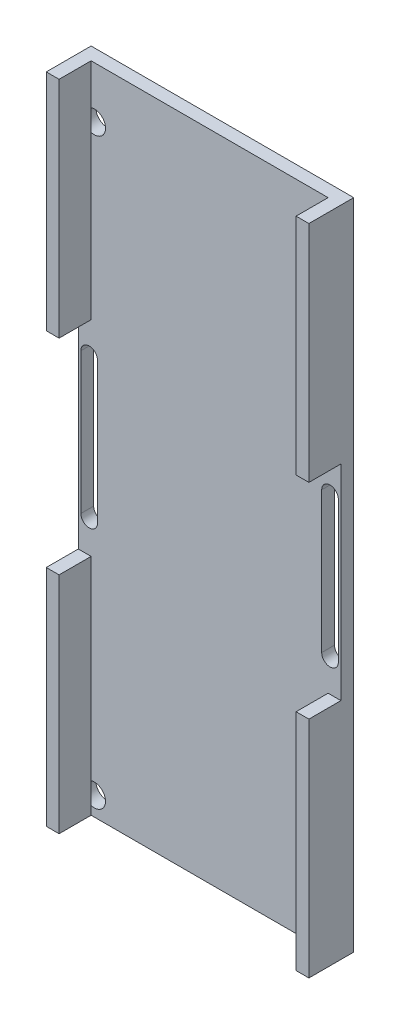
ISO-10303-21;
HEADER;
FILE_DESCRIPTION(('STEP AP214'),'2;1');
FILE_NAME('part.step','',(''),(''),'','','');
FILE_SCHEMA(('AUTOMOTIVE_DESIGN { 1 0 10303 214 1 1 1 1 }'));
ENDSEC;
DATA;
#1=APPLICATION_CONTEXT('core data for automotive mechanical design processes');
#2=APPLICATION_PROTOCOL_DEFINITION('international standard','automotive_design',2000,#1);
#3=PRODUCT_CONTEXT('',#1,'mechanical');
#4=PRODUCT('Part','Part','',(#3));
#5=PRODUCT_RELATED_PRODUCT_CATEGORY('part','',(#4));
#6=PRODUCT_DEFINITION_FORMATION('','',#4);
#7=PRODUCT_DEFINITION_CONTEXT('part definition',#1,'design');
#8=PRODUCT_DEFINITION('design','',#6,#7);
#9=PRODUCT_DEFINITION_SHAPE('','',#8);
#10=(LENGTH_UNIT() NAMED_UNIT(*) SI_UNIT(.MILLI.,.METRE.));
#11=(NAMED_UNIT(*) PLANE_ANGLE_UNIT() SI_UNIT($,.RADIAN.));
#12=(NAMED_UNIT(*) SI_UNIT($,.STERADIAN.) SOLID_ANGLE_UNIT());
#13=UNCERTAINTY_MEASURE_WITH_UNIT(LENGTH_MEASURE(1.E-05),#10,'distance_accuracy_value','');
#14=(GEOMETRIC_REPRESENTATION_CONTEXT(3) GLOBAL_UNCERTAINTY_ASSIGNED_CONTEXT((#13)) GLOBAL_UNIT_ASSIGNED_CONTEXT((#10,
#11,#12)) REPRESENTATION_CONTEXT('',''));
#15=CARTESIAN_POINT('',(0.,0.,0.));
#16=DIRECTION('',(0.,0.,1.));
#17=DIRECTION('',(1.,0.,0.));
#18=AXIS2_PLACEMENT_3D('',#15,#16,#17);
#19=CARTESIAN_POINT('',(0.,0.,2.));
#20=DIRECTION('',(0.,0.,1.));
#21=DIRECTION('',(1.,0.,0.));
#22=AXIS2_PLACEMENT_3D('',#19,#20,#21);
#23=PLANE('',#22);
#24=DIRECTION('',(0.,-1.,0.));
#25=VECTOR('',#24,1.);
#26=CARTESIAN_POINT('',(18.5,-16.,2.));
#27=LINE('',#26,#25);
#28=CARTESIAN_POINT('',(18.5,-49.6770509831248,2.));
#29=VERTEX_POINT('',#28);
#30=CARTESIAN_POINT('',(18.5,-51.,2.));
#31=VERTEX_POINT('',#30);
#32=EDGE_CURVE('E11',#29,#31,#27,.T.);
#33=ORIENTED_EDGE('',*,*,#32,.F.);
#34=CARTESIAN_POINT('',(18.,-48.,2.));
#35=DIRECTION('',(0.,0.,1.));
#36=DIRECTION('',(1.,0.,0.));
#37=AXIS2_PLACEMENT_3D('',#34,#35,#36);
#38=CIRCLE('',#37,1.75);
#39=CARTESIAN_POINT('',(18.5,-46.3229490168752,2.));
#40=VERTEX_POINT('',#39);
#41=EDGE_CURVE('E407',#40,#29,#38,.T.);
#42=ORIENTED_EDGE('',*,*,#41,.F.);
#43=CARTESIAN_POINT('',(18.5,-16.,2.));
#44=VERTEX_POINT('',#43);
#45=EDGE_CURVE('E50',#44,#40,#27,.T.);
#46=ORIENTED_EDGE('',*,*,#45,.F.);
#47=DIRECTION('',(-1.,0.,0.));
#48=VECTOR('',#47,1.);
#49=CARTESIAN_POINT('',(20.5,-16.,2.));
#50=LINE('',#49,#48);
#51=CARTESIAN_POINT('',(20.5,-16.,2.));
#52=VERTEX_POINT('',#51);
#53=EDGE_CURVE('E228',#52,#44,#50,.T.);
#54=ORIENTED_EDGE('',*,*,#53,.F.);
#55=DIRECTION('',(0.,1.,0.));
#56=VECTOR('',#55,1.);
#57=CARTESIAN_POINT('',(20.5,-51.,2.));
#58=LINE('',#57,#56);
#59=CARTESIAN_POINT('',(20.5,16.,2.));
#60=VERTEX_POINT('',#59);
#61=EDGE_CURVE('E225',#52,#60,#58,.T.);
#62=ORIENTED_EDGE('',*,*,#61,.T.);
#63=DIRECTION('',(1.,0.,0.));
#64=VECTOR('',#63,1.);
#65=CARTESIAN_POINT('',(18.5,16.,2.));
#66=LINE('',#65,#64);
#67=CARTESIAN_POINT('',(18.5,16.,2.));
#68=VERTEX_POINT('',#67);
#69=EDGE_CURVE('E58',#68,#60,#66,.T.);
#70=ORIENTED_EDGE('',*,*,#69,.F.);
#71=DIRECTION('',(0.,-1.,0.));
#72=VECTOR('',#71,1.);
#73=CARTESIAN_POINT('',(18.5,51.,2.));
#74=LINE('',#73,#72);
#75=CARTESIAN_POINT('',(18.5,41.3229490168751,2.));
#76=VERTEX_POINT('',#75);
#77=EDGE_CURVE('E62',#76,#68,#74,.T.);
#78=ORIENTED_EDGE('',*,*,#77,.F.);
#79=CARTESIAN_POINT('',(18.,43.,2.));
#80=DIRECTION('',(0.,0.,1.));
#81=DIRECTION('',(1.,0.,0.));
#82=AXIS2_PLACEMENT_3D('',#79,#80,#81);
#83=CIRCLE('',#82,1.75);
#84=CARTESIAN_POINT('',(18.5,44.6770509831248,2.));
#85=VERTEX_POINT('',#84);
#86=EDGE_CURVE('E401',#85,#76,#83,.T.);
#87=ORIENTED_EDGE('',*,*,#86,.F.);
#88=CARTESIAN_POINT('',(18.5,51.,2.));
#89=VERTEX_POINT('',#88);
#90=EDGE_CURVE('E257',#89,#85,#74,.T.);
#91=ORIENTED_EDGE('',*,*,#90,.F.);
#92=DIRECTION('',(-1.,0.,0.));
#93=VECTOR('',#92,1.);
#94=CARTESIAN_POINT('',(20.5,51.,2.));
#95=LINE('',#94,#93);
#96=CARTESIAN_POINT('',(-18.5,51.,2.));
#97=VERTEX_POINT('',#96);
#98=EDGE_CURVE('E233',#89,#97,#95,.T.);
#99=ORIENTED_EDGE('',*,*,#98,.T.);
#100=DIRECTION('',(0.,1.,0.));
#101=VECTOR('',#100,1.);
#102=CARTESIAN_POINT('',(-18.5,16.,2.));
#103=LINE('',#102,#101);
#104=CARTESIAN_POINT('',(-18.5,44.6770509831248,2.));
#105=VERTEX_POINT('',#104);
#106=EDGE_CURVE('E48',#105,#97,#103,.T.);
#107=ORIENTED_EDGE('',*,*,#106,.F.);
#108=CARTESIAN_POINT('',(-18.,43.,2.));
#109=DIRECTION('',(0.,0.,1.));
#110=DIRECTION('',(1.,0.,0.));
#111=AXIS2_PLACEMENT_3D('',#108,#109,#110);
#112=CIRCLE('',#111,1.75);
#113=CARTESIAN_POINT('',(-18.5,41.3229490168751,2.));
#114=VERTEX_POINT('',#113);
#115=EDGE_CURVE('E418',#114,#105,#112,.T.);
#116=ORIENTED_EDGE('',*,*,#115,.F.);
#117=CARTESIAN_POINT('',(-18.5,16.,2.));
#118=VERTEX_POINT('',#117);
#119=EDGE_CURVE('E298',#118,#114,#103,.T.);
#120=ORIENTED_EDGE('',*,*,#119,.F.);
#121=DIRECTION('',(1.,0.,0.));
#122=VECTOR('',#121,1.);
#123=CARTESIAN_POINT('',(-20.5,16.,2.));
#124=LINE('',#123,#122);
#125=CARTESIAN_POINT('',(-20.5,16.,2.));
#126=VERTEX_POINT('',#125);
#127=EDGE_CURVE('E271',#126,#118,#124,.T.);
#128=ORIENTED_EDGE('',*,*,#127,.F.);
#129=DIRECTION('',(0.,-1.,0.));
#130=VECTOR('',#129,1.);
#131=CARTESIAN_POINT('',(-20.5,51.,2.));
#132=LINE('',#131,#130);
#133=CARTESIAN_POINT('',(-20.5,-16.,2.));
#134=VERTEX_POINT('',#133);
#135=EDGE_CURVE('E428',#126,#134,#132,.T.);
#136=ORIENTED_EDGE('',*,*,#135,.T.);
#137=DIRECTION('',(-1.,0.,0.));
#138=VECTOR('',#137,1.);
#139=CARTESIAN_POINT('',(-18.5,-16.,2.));
#140=LINE('',#139,#138);
#141=CARTESIAN_POINT('',(-18.5,-16.,2.));
#142=VERTEX_POINT('',#141);
#143=EDGE_CURVE('E317',#142,#134,#140,.T.);
#144=ORIENTED_EDGE('',*,*,#143,.F.);
#145=DIRECTION('',(0.,1.,0.));
#146=VECTOR('',#145,1.);
#147=CARTESIAN_POINT('',(-18.5,-51.,2.));
#148=LINE('',#147,#146);
#149=CARTESIAN_POINT('',(-18.5,-46.3229490168752,2.));
#150=VERTEX_POINT('',#149);
#151=EDGE_CURVE('E327',#150,#142,#148,.T.);
#152=ORIENTED_EDGE('',*,*,#151,.F.);
#153=CARTESIAN_POINT('',(-18.,-48.,2.));
#154=DIRECTION('',(0.,0.,1.));
#155=DIRECTION('',(1.,0.,0.));
#156=AXIS2_PLACEMENT_3D('',#153,#154,#155);
#157=CIRCLE('',#156,1.75);
#158=CARTESIAN_POINT('',(-18.5,-49.6770509831248,2.));
#159=VERTEX_POINT('',#158);
#160=EDGE_CURVE('E425',#159,#150,#157,.T.);
#161=ORIENTED_EDGE('',*,*,#160,.F.);
#162=CARTESIAN_POINT('',(-18.5,-51.,2.));
#163=VERTEX_POINT('',#162);
#164=EDGE_CURVE('E324',#163,#159,#148,.T.);
#165=ORIENTED_EDGE('',*,*,#164,.F.);
#166=DIRECTION('',(1.,0.,0.));
#167=VECTOR('',#166,1.);
#168=CARTESIAN_POINT('',(-20.5,-51.,2.));
#169=LINE('',#168,#167);
#170=EDGE_CURVE('E234',#163,#31,#169,.T.);
#171=ORIENTED_EDGE('',*,*,#170,.T.);
#172=EDGE_LOOP('',(#33,#42,#46,#54,#62,#70,#78,#87,#91,#99,#107,#116,#120,#128,#136,#144,#152,
#161,#165,#171));
#173=FACE_BOUND('',#172,.T.);
#174=DIRECTION('',(0.,1.,0.));
#175=VECTOR('',#174,1.);
#176=CARTESIAN_POINT('',(-17.5,-11.,2.));
#177=LINE('',#176,#175);
#178=CARTESIAN_POINT('',(-17.5,-11.,2.));
#179=VERTEX_POINT('',#178);
#180=CARTESIAN_POINT('',(-17.5,11.,2.));
#181=VERTEX_POINT('',#180);
#182=EDGE_CURVE('E372',#179,#181,#177,.T.);
#183=ORIENTED_EDGE('',*,*,#182,.F.);
#184=CARTESIAN_POINT('',(-18.8,-11.,2.));
#185=DIRECTION('',(0.,0.,1.));
#186=DIRECTION('',(1.,0.,0.));
#187=AXIS2_PLACEMENT_3D('',#184,#185,#186);
#188=CIRCLE('',#187,1.3);
#189=CARTESIAN_POINT('',(-20.1,-11.,2.));
#190=VERTEX_POINT('',#189);
#191=EDGE_CURVE('E370',#190,#179,#188,.T.);
#192=ORIENTED_EDGE('',*,*,#191,.F.);
#193=DIRECTION('',(0.,-1.,0.));
#194=VECTOR('',#193,1.);
#195=CARTESIAN_POINT('',(-20.1,11.,2.));
#196=LINE('',#195,#194);
#197=CARTESIAN_POINT('',(-20.1,11.,2.));
#198=VERTEX_POINT('',#197);
#199=EDGE_CURVE('E378',#198,#190,#196,.T.);
#200=ORIENTED_EDGE('',*,*,#199,.F.);
#201=CARTESIAN_POINT('',(-18.8,11.,2.));
#202=DIRECTION('',(0.,0.,1.));
#203=DIRECTION('',(1.,0.,0.));
#204=AXIS2_PLACEMENT_3D('',#201,#202,#203);
#205=CIRCLE('',#204,1.3);
#206=EDGE_CURVE('E375',#181,#198,#205,.T.);
#207=ORIENTED_EDGE('',*,*,#206,.F.);
#208=EDGE_LOOP('',(#183,#192,#200,#207));
#209=FACE_BOUND('',#208,.T.);
#210=DIRECTION('',(0.,1.,0.));
#211=VECTOR('',#210,1.);
#212=CARTESIAN_POINT('',(20.1,-11.,2.));
#213=LINE('',#212,#211);
#214=CARTESIAN_POINT('',(20.1,-11.,2.));
#215=VERTEX_POINT('',#214);
#216=CARTESIAN_POINT('',(20.1,11.,2.));
#217=VERTEX_POINT('',#216);
#218=EDGE_CURVE('E341',#215,#217,#213,.T.);
#219=ORIENTED_EDGE('',*,*,#218,.F.);
#220=CARTESIAN_POINT('',(18.8,-11.,2.));
#221=DIRECTION('',(0.,0.,1.));
#222=DIRECTION('',(1.,0.,0.));
#223=AXIS2_PLACEMENT_3D('',#220,#221,#222);
#224=CIRCLE('',#223,1.3);
#225=CARTESIAN_POINT('',(17.5,-11.,2.));
#226=VERTEX_POINT('',#225);
#227=EDGE_CURVE('E339',#226,#215,#224,.T.);
#228=ORIENTED_EDGE('',*,*,#227,.F.);
#229=DIRECTION('',(0.,-1.,0.));
#230=VECTOR('',#229,1.);
#231=CARTESIAN_POINT('',(17.5,11.,2.));
#232=LINE('',#231,#230);
#233=CARTESIAN_POINT('',(17.5,11.,2.));
#234=VERTEX_POINT('',#233);
#235=EDGE_CURVE('E347',#234,#226,#232,.T.);
#236=ORIENTED_EDGE('',*,*,#235,.F.);
#237=CARTESIAN_POINT('',(18.8,11.,2.));
#238=DIRECTION('',(0.,0.,1.));
#239=DIRECTION('',(1.,0.,0.));
#240=AXIS2_PLACEMENT_3D('',#237,#238,#239);
#241=CIRCLE('',#240,1.3);
#242=EDGE_CURVE('E344',#217,#234,#241,.T.);
#243=ORIENTED_EDGE('',*,*,#242,.F.);
#244=EDGE_LOOP('',(#219,#228,#236,#243));
#245=FACE_BOUND('',#244,.T.);
#246=ADVANCED_FACE('F39',(#173,#209,#245),#23,.T.);
#247=CARTESIAN_POINT('',(0.,0.,0.));
#248=DIRECTION('',(0.,0.,1.));
#249=DIRECTION('',(1.,0.,0.));
#250=AXIS2_PLACEMENT_3D('',#247,#248,#249);
#251=PLANE('',#250);
#252=CARTESIAN_POINT('',(-18.8,-11.,0.));
#253=DIRECTION('',(0.,0.,1.));
#254=DIRECTION('',(1.,0.,0.));
#255=AXIS2_PLACEMENT_3D('',#252,#253,#254);
#256=CIRCLE('',#255,1.3);
#257=CARTESIAN_POINT('',(-20.1,-11.,0.));
#258=VERTEX_POINT('',#257);
#259=CARTESIAN_POINT('',(-17.5,-11.,0.));
#260=VERTEX_POINT('',#259);
#261=EDGE_CURVE('E369',#258,#260,#256,.T.);
#262=ORIENTED_EDGE('',*,*,#261,.T.);
#263=DIRECTION('',(0.,1.,0.));
#264=VECTOR('',#263,1.);
#265=CARTESIAN_POINT('',(-17.5,-11.,0.));
#266=LINE('',#265,#264);
#267=CARTESIAN_POINT('',(-17.5,11.,0.));
#268=VERTEX_POINT('',#267);
#269=EDGE_CURVE('E383',#260,#268,#266,.T.);
#270=ORIENTED_EDGE('',*,*,#269,.T.);
#271=CARTESIAN_POINT('',(-18.8,11.,0.));
#272=DIRECTION('',(0.,0.,1.));
#273=DIRECTION('',(1.,0.,0.));
#274=AXIS2_PLACEMENT_3D('',#271,#272,#273);
#275=CIRCLE('',#274,1.3);
#276=CARTESIAN_POINT('',(-20.1,11.,0.));
#277=VERTEX_POINT('',#276);
#278=EDGE_CURVE('E386',#268,#277,#275,.T.);
#279=ORIENTED_EDGE('',*,*,#278,.T.);
#280=DIRECTION('',(0.,-1.,0.));
#281=VECTOR('',#280,1.);
#282=CARTESIAN_POINT('',(-20.1,11.,0.));
#283=LINE('',#282,#281);
#284=EDGE_CURVE('E373',#277,#258,#283,.T.);
#285=ORIENTED_EDGE('',*,*,#284,.T.);
#286=EDGE_LOOP('',(#262,#270,#279,#285));
#287=FACE_BOUND('',#286,.T.);
#288=DIRECTION('',(0.,-1.,0.));
#289=VECTOR('',#288,1.);
#290=CARTESIAN_POINT('',(-20.5,51.,0.));
#291=LINE('',#290,#289);
#292=CARTESIAN_POINT('',(-20.5,51.,0.));
#293=VERTEX_POINT('',#292);
#294=CARTESIAN_POINT('',(-20.5,-51.,0.));
#295=VERTEX_POINT('',#294);
#296=EDGE_CURVE('E424',#293,#295,#291,.T.);
#297=ORIENTED_EDGE('',*,*,#296,.F.);
#298=DIRECTION('',(-1.,0.,0.));
#299=VECTOR('',#298,1.);
#300=CARTESIAN_POINT('',(20.5,51.,0.));
#301=LINE('',#300,#299);
#302=CARTESIAN_POINT('',(20.5,51.,0.));
#303=VERTEX_POINT('',#302);
#304=EDGE_CURVE('E430',#303,#293,#301,.T.);
#305=ORIENTED_EDGE('',*,*,#304,.F.);
#306=DIRECTION('',(0.,1.,0.));
#307=VECTOR('',#306,1.);
#308=CARTESIAN_POINT('',(20.5,-51.,0.));
#309=LINE('',#308,#307);
#310=CARTESIAN_POINT('',(20.5,-51.,0.));
#311=VERTEX_POINT('',#310);
#312=EDGE_CURVE('E438',#311,#303,#309,.T.);
#313=ORIENTED_EDGE('',*,*,#312,.F.);
#314=DIRECTION('',(1.,0.,0.));
#315=VECTOR('',#314,1.);
#316=CARTESIAN_POINT('',(-20.5,-51.,0.));
#317=LINE('',#316,#315);
#318=EDGE_CURVE('E436',#295,#311,#317,.T.);
#319=ORIENTED_EDGE('',*,*,#318,.F.);
#320=EDGE_LOOP('',(#297,#305,#313,#319));
#321=FACE_BOUND('',#320,.T.);
#322=CARTESIAN_POINT('',(-18.,-48.,0.));
#323=DIRECTION('',(0.,0.,1.));
#324=DIRECTION('',(1.,0.,0.));
#325=AXIS2_PLACEMENT_3D('',#322,#323,#324);
#326=CIRCLE('',#325,1.75);
#327=CARTESIAN_POINT('',(-16.25,-48.,0.));
#328=VERTEX_POINT('',#327);
#329=EDGE_CURVE('E417',#328,#328,#326,.T.);
#330=ORIENTED_EDGE('',*,*,#329,.T.);
#331=EDGE_LOOP('',(#330));
#332=FACE_BOUND('',#331,.T.);
#333=CARTESIAN_POINT('',(-18.,43.,0.));
#334=DIRECTION('',(0.,0.,1.));
#335=DIRECTION('',(1.,0.,0.));
#336=AXIS2_PLACEMENT_3D('',#333,#334,#335);
#337=CIRCLE('',#336,1.75);
#338=CARTESIAN_POINT('',(-16.25,43.,0.));
#339=VERTEX_POINT('',#338);
#340=EDGE_CURVE('E410',#339,#339,#337,.T.);
#341=ORIENTED_EDGE('',*,*,#340,.T.);
#342=EDGE_LOOP('',(#341));
#343=FACE_BOUND('',#342,.T.);
#344=CARTESIAN_POINT('',(18.,-48.,0.));
#345=DIRECTION('',(0.,0.,1.));
#346=DIRECTION('',(1.,0.,0.));
#347=AXIS2_PLACEMENT_3D('',#344,#345,#346);
#348=CIRCLE('',#347,1.75);
#349=CARTESIAN_POINT('',(19.75,-48.,0.));
#350=VERTEX_POINT('',#349);
#351=EDGE_CURVE('E403',#350,#350,#348,.T.);
#352=ORIENTED_EDGE('',*,*,#351,.T.);
#353=EDGE_LOOP('',(#352));
#354=FACE_BOUND('',#353,.T.);
#355=CARTESIAN_POINT('',(18.,43.,0.));
#356=DIRECTION('',(0.,0.,1.));
#357=DIRECTION('',(1.,0.,0.));
#358=AXIS2_PLACEMENT_3D('',#355,#356,#357);
#359=CIRCLE('',#358,1.75);
#360=CARTESIAN_POINT('',(19.75,43.,0.));
#361=VERTEX_POINT('',#360);
#362=EDGE_CURVE('E400',#361,#361,#359,.T.);
#363=ORIENTED_EDGE('',*,*,#362,.T.);
#364=EDGE_LOOP('',(#363));
#365=FACE_BOUND('',#364,.T.);
#366=CARTESIAN_POINT('',(18.8,-11.,0.));
#367=DIRECTION('',(0.,0.,1.));
#368=DIRECTION('',(1.,0.,0.));
#369=AXIS2_PLACEMENT_3D('',#366,#367,#368);
#370=CIRCLE('',#369,1.3);
#371=CARTESIAN_POINT('',(17.5,-11.,0.));
#372=VERTEX_POINT('',#371);
#373=CARTESIAN_POINT('',(20.1,-11.,0.));
#374=VERTEX_POINT('',#373);
#375=EDGE_CURVE('E338',#372,#374,#370,.T.);
#376=ORIENTED_EDGE('',*,*,#375,.T.);
#377=DIRECTION('',(0.,1.,0.));
#378=VECTOR('',#377,1.);
#379=CARTESIAN_POINT('',(20.1,-11.,0.));
#380=LINE('',#379,#378);
#381=CARTESIAN_POINT('',(20.1,11.,0.));
#382=VERTEX_POINT('',#381);
#383=EDGE_CURVE('E352',#374,#382,#380,.T.);
#384=ORIENTED_EDGE('',*,*,#383,.T.);
#385=CARTESIAN_POINT('',(18.8,11.,0.));
#386=DIRECTION('',(0.,0.,1.));
#387=DIRECTION('',(1.,0.,0.));
#388=AXIS2_PLACEMENT_3D('',#385,#386,#387);
#389=CIRCLE('',#388,1.3);
#390=CARTESIAN_POINT('',(17.5,11.,0.));
#391=VERTEX_POINT('',#390);
#392=EDGE_CURVE('E355',#382,#391,#389,.T.);
#393=ORIENTED_EDGE('',*,*,#392,.T.);
#394=DIRECTION('',(0.,-1.,0.));
#395=VECTOR('',#394,1.);
#396=CARTESIAN_POINT('',(17.5,11.,0.));
#397=LINE('',#396,#395);
#398=EDGE_CURVE('E342',#391,#372,#397,.T.);
#399=ORIENTED_EDGE('',*,*,#398,.T.);
#400=EDGE_LOOP('',(#376,#384,#393,#399));
#401=FACE_BOUND('',#400,.T.);
#402=ADVANCED_FACE('F500',(#287,#321,#332,#343,#354,#365,#401),#251,.F.);
#403=CARTESIAN_POINT('',(-20.5,51.,2.));
#404=DIRECTION('',(1.,0.,0.));
#405=DIRECTION('',(0.,0.,-1.));
#406=AXIS2_PLACEMENT_3D('',#403,#404,#405);
#407=PLANE('',#406);
#408=ORIENTED_EDGE('',*,*,#296,.T.);
#409=DIRECTION('',(0.,0.,-1.));
#410=VECTOR('',#409,1.);
#411=CARTESIAN_POINT('',(-20.5,-51.,2.));
#412=LINE('',#411,#410);
#413=CARTESIAN_POINT('',(-20.5,-51.,7.));
#414=VERTEX_POINT('',#413);
#415=EDGE_CURVE('E43',#414,#295,#412,.T.);
#416=ORIENTED_EDGE('',*,*,#415,.F.);
#417=DIRECTION('',(0.,-1.,0.));
#418=VECTOR('',#417,1.);
#419=CARTESIAN_POINT('',(-20.5,-16.,7.));
#420=LINE('',#419,#418);
#421=CARTESIAN_POINT('',(-20.5,-16.,7.));
#422=VERTEX_POINT('',#421);
#423=EDGE_CURVE('E313',#422,#414,#420,.T.);
#424=ORIENTED_EDGE('',*,*,#423,.F.);
#425=DIRECTION('',(0.,0.,-1.));
#426=VECTOR('',#425,1.);
#427=CARTESIAN_POINT('',(-20.5,-16.,7.));
#428=LINE('',#427,#426);
#429=EDGE_CURVE('E323',#422,#134,#428,.T.);
#430=ORIENTED_EDGE('',*,*,#429,.T.);
#431=ORIENTED_EDGE('',*,*,#135,.F.);
#432=DIRECTION('',(0.,0.,-1.));
#433=VECTOR('',#432,1.);
#434=CARTESIAN_POINT('',(-20.5,16.,7.));
#435=LINE('',#434,#433);
#436=CARTESIAN_POINT('',(-20.5,16.,7.));
#437=VERTEX_POINT('',#436);
#438=EDGE_CURVE('E260',#437,#126,#435,.T.);
#439=ORIENTED_EDGE('',*,*,#438,.F.);
#440=DIRECTION('',(0.,-1.,0.));
#441=VECTOR('',#440,1.);
#442=CARTESIAN_POINT('',(-20.5,51.,7.));
#443=LINE('',#442,#441);
#444=CARTESIAN_POINT('',(-20.5,51.,7.));
#445=VERTEX_POINT('',#444);
#446=EDGE_CURVE('E310',#445,#437,#443,.T.);
#447=ORIENTED_EDGE('',*,*,#446,.F.);
#448=DIRECTION('',(0.,0.,-1.));
#449=VECTOR('',#448,1.);
#450=CARTESIAN_POINT('',(-20.5,51.,2.));
#451=LINE('',#450,#449);
#452=EDGE_CURVE('E433',#445,#293,#451,.T.);
#453=ORIENTED_EDGE('',*,*,#452,.T.);
#454=EDGE_LOOP('',(#408,#416,#424,#430,#431,#439,#447,#453));
#455=FACE_BOUND('',#454,.T.);
#456=ADVANCED_FACE('F41',(#455),#407,.F.);
#457=CARTESIAN_POINT('',(-20.5,-51.,2.));
#458=DIRECTION('',(0.,1.,0.));
#459=DIRECTION('',(0.,0.,1.));
#460=AXIS2_PLACEMENT_3D('',#457,#458,#459);
#461=PLANE('',#460);
#462=ORIENTED_EDGE('',*,*,#318,.T.);
#463=DIRECTION('',(0.,0.,-1.));
#464=VECTOR('',#463,1.);
#465=CARTESIAN_POINT('',(20.5,-51.,2.));
#466=LINE('',#465,#464);
#467=CARTESIAN_POINT('',(20.5,-51.,7.));
#468=VERTEX_POINT('',#467);
#469=EDGE_CURVE('E445',#468,#311,#466,.T.);
#470=ORIENTED_EDGE('',*,*,#469,.F.);
#471=DIRECTION('',(1.,0.,0.));
#472=VECTOR('',#471,1.);
#473=CARTESIAN_POINT('',(18.5,-51.,7.));
#474=LINE('',#473,#472);
#475=CARTESIAN_POINT('',(18.5,-51.,7.));
#476=VERTEX_POINT('',#475);
#477=EDGE_CURVE('E284',#476,#468,#474,.T.);
#478=ORIENTED_EDGE('',*,*,#477,.F.);
#479=DIRECTION('',(0.,0.,-1.));
#480=VECTOR('',#479,1.);
#481=CARTESIAN_POINT('',(18.5,-51.,7.));
#482=LINE('',#481,#480);
#483=EDGE_CURVE('E267',#476,#31,#482,.T.);
#484=ORIENTED_EDGE('',*,*,#483,.T.);
#485=ORIENTED_EDGE('',*,*,#170,.F.);
#486=DIRECTION('',(0.,0.,-1.));
#487=VECTOR('',#486,1.);
#488=CARTESIAN_POINT('',(-18.5,-51.,7.));
#489=LINE('',#488,#487);
#490=CARTESIAN_POINT('',(-18.5,-51.,7.));
#491=VERTEX_POINT('',#490);
#492=EDGE_CURVE('E335',#491,#163,#489,.T.);
#493=ORIENTED_EDGE('',*,*,#492,.F.);
#494=DIRECTION('',(1.,0.,0.));
#495=VECTOR('',#494,1.);
#496=CARTESIAN_POINT('',(-20.5,-51.,7.));
#497=LINE('',#496,#495);
#498=EDGE_CURVE('E316',#414,#491,#497,.T.);
#499=ORIENTED_EDGE('',*,*,#498,.F.);
#500=ORIENTED_EDGE('',*,*,#415,.T.);
#501=EDGE_LOOP('',(#462,#470,#478,#484,#485,#493,#499,#500));
#502=FACE_BOUND('',#501,.T.);
#503=ADVANCED_FACE('F478',(#502),#461,.F.);
#504=CARTESIAN_POINT('',(20.5,-51.,2.));
#505=DIRECTION('',(-1.,0.,0.));
#506=DIRECTION('',(0.,0.,1.));
#507=AXIS2_PLACEMENT_3D('',#504,#505,#506);
#508=PLANE('',#507);
#509=ORIENTED_EDGE('',*,*,#312,.T.);
#510=DIRECTION('',(0.,0.,-1.));
#511=VECTOR('',#510,1.);
#512=CARTESIAN_POINT('',(20.5,51.,2.));
#513=LINE('',#512,#511);
#514=CARTESIAN_POINT('',(20.5,51.,7.));
#515=VERTEX_POINT('',#514);
#516=EDGE_CURVE('E443',#515,#303,#513,.T.);
#517=ORIENTED_EDGE('',*,*,#516,.F.);
#518=DIRECTION('',(0.,1.,0.));
#519=VECTOR('',#518,1.);
#520=CARTESIAN_POINT('',(20.5,16.,7.));
#521=LINE('',#520,#519);
#522=CARTESIAN_POINT('',(20.5,16.,7.));
#523=VERTEX_POINT('',#522);
#524=EDGE_CURVE('E249',#523,#515,#521,.T.);
#525=ORIENTED_EDGE('',*,*,#524,.F.);
#526=DIRECTION('',(0.,0.,-1.));
#527=VECTOR('',#526,1.);
#528=CARTESIAN_POINT('',(20.5,16.,7.));
#529=LINE('',#528,#527);
#530=EDGE_CURVE('E240',#523,#60,#529,.T.);
#531=ORIENTED_EDGE('',*,*,#530,.T.);
#532=ORIENTED_EDGE('',*,*,#61,.F.);
#533=DIRECTION('',(0.,0.,-1.));
#534=VECTOR('',#533,1.);
#535=CARTESIAN_POINT('',(20.5,-16.,7.));
#536=LINE('',#535,#534);
#537=CARTESIAN_POINT('',(20.5,-16.,7.));
#538=VERTEX_POINT('',#537);
#539=EDGE_CURVE('E270',#538,#52,#536,.T.);
#540=ORIENTED_EDGE('',*,*,#539,.F.);
#541=DIRECTION('',(0.,1.,0.));
#542=VECTOR('',#541,1.);
#543=CARTESIAN_POINT('',(20.5,-51.,7.));
#544=LINE('',#543,#542);
#545=EDGE_CURVE('E282',#468,#538,#544,.T.);
#546=ORIENTED_EDGE('',*,*,#545,.F.);
#547=ORIENTED_EDGE('',*,*,#469,.T.);
#548=EDGE_LOOP('',(#509,#517,#525,#531,#532,#540,#546,#547));
#549=FACE_BOUND('',#548,.T.);
#550=ADVANCED_FACE('F247',(#549),#508,.F.);
#551=CARTESIAN_POINT('',(20.5,51.,2.));
#552=DIRECTION('',(0.,-1.,0.));
#553=DIRECTION('',(0.,0.,-1.));
#554=AXIS2_PLACEMENT_3D('',#551,#552,#553);
#555=PLANE('',#554);
#556=ORIENTED_EDGE('',*,*,#304,.T.);
#557=ORIENTED_EDGE('',*,*,#452,.F.);
#558=DIRECTION('',(-1.,0.,0.));
#559=VECTOR('',#558,1.);
#560=CARTESIAN_POINT('',(-18.5,51.,7.));
#561=LINE('',#560,#559);
#562=CARTESIAN_POINT('',(-18.5,51.,7.));
#563=VERTEX_POINT('',#562);
#564=EDGE_CURVE('E297',#563,#445,#561,.T.);
#565=ORIENTED_EDGE('',*,*,#564,.F.);
#566=DIRECTION('',(0.,0.,-1.));
#567=VECTOR('',#566,1.);
#568=CARTESIAN_POINT('',(-18.5,51.,7.));
#569=LINE('',#568,#567);
#570=EDGE_CURVE('E294',#563,#97,#569,.T.);
#571=ORIENTED_EDGE('',*,*,#570,.T.);
#572=ORIENTED_EDGE('',*,*,#98,.F.);
#573=DIRECTION('',(0.,0.,-1.));
#574=VECTOR('',#573,1.);
#575=CARTESIAN_POINT('',(18.5,51.,7.));
#576=LINE('',#575,#574);
#577=CARTESIAN_POINT('',(18.5,51.,7.));
#578=VERTEX_POINT('',#577);
#579=EDGE_CURVE('E250',#578,#89,#576,.T.);
#580=ORIENTED_EDGE('',*,*,#579,.F.);
#581=DIRECTION('',(-1.,0.,0.));
#582=VECTOR('',#581,1.);
#583=CARTESIAN_POINT('',(20.5,51.,7.));
#584=LINE('',#583,#582);
#585=EDGE_CURVE('E253',#515,#578,#584,.T.);
#586=ORIENTED_EDGE('',*,*,#585,.F.);
#587=ORIENTED_EDGE('',*,*,#516,.T.);
#588=EDGE_LOOP('',(#556,#557,#565,#571,#572,#580,#586,#587));
#589=FACE_BOUND('',#588,.T.);
#590=ADVANCED_FACE('F505',(#589),#555,.F.);
#591=CARTESIAN_POINT('',(-18.,-48.,2.));
#592=DIRECTION('',(0.,0.,-1.));
#593=DIRECTION('',(-1.,0.,0.));
#594=AXIS2_PLACEMENT_3D('',#591,#592,#593);
#595=CYLINDRICAL_SURFACE('',#594,1.75);
#596=EDGE_CURVE('E421',#150,#159,#157,.T.);
#597=ORIENTED_EDGE('',*,*,#596,.T.);
#598=ORIENTED_EDGE('',*,*,#160,.T.);
#599=EDGE_LOOP('',(#597,#598));
#600=FACE_BOUND('',#599,.T.);
#601=ORIENTED_EDGE('',*,*,#329,.F.);
#602=EDGE_LOOP('',(#601));
#603=FACE_BOUND('',#602,.T.);
#604=ADVANCED_FACE('F463',(#600,#603),#595,.F.);
#605=CARTESIAN_POINT('',(-18.,43.,2.));
#606=DIRECTION('',(0.,0.,-1.));
#607=DIRECTION('',(-1.,0.,0.));
#608=AXIS2_PLACEMENT_3D('',#605,#606,#607);
#609=CYLINDRICAL_SURFACE('',#608,1.75);
#610=EDGE_CURVE('E414',#105,#114,#112,.T.);
#611=ORIENTED_EDGE('',*,*,#610,.T.);
#612=ORIENTED_EDGE('',*,*,#115,.T.);
#613=EDGE_LOOP('',(#611,#612));
#614=FACE_BOUND('',#613,.T.);
#615=ORIENTED_EDGE('',*,*,#340,.F.);
#616=EDGE_LOOP('',(#615));
#617=FACE_BOUND('',#616,.T.);
#618=ADVANCED_FACE('F532',(#614,#617),#609,.F.);
#619=CARTESIAN_POINT('',(18.,-48.,2.));
#620=DIRECTION('',(0.,0.,-1.));
#621=DIRECTION('',(-1.,0.,0.));
#622=AXIS2_PLACEMENT_3D('',#619,#620,#621);
#623=CYLINDRICAL_SURFACE('',#622,1.75);
#624=ORIENTED_EDGE('',*,*,#41,.T.);
#625=EDGE_CURVE('E411',#29,#40,#38,.T.);
#626=ORIENTED_EDGE('',*,*,#625,.T.);
#627=EDGE_LOOP('',(#624,#626));
#628=FACE_BOUND('',#627,.T.);
#629=ORIENTED_EDGE('',*,*,#351,.F.);
#630=EDGE_LOOP('',(#629));
#631=FACE_BOUND('',#630,.T.);
#632=ADVANCED_FACE('F490',(#628,#631),#623,.F.);
#633=CARTESIAN_POINT('',(18.,43.,2.));
#634=DIRECTION('',(0.,0.,-1.));
#635=DIRECTION('',(-1.,0.,0.));
#636=AXIS2_PLACEMENT_3D('',#633,#634,#635);
#637=CYLINDRICAL_SURFACE('',#636,1.75);
#638=ORIENTED_EDGE('',*,*,#86,.T.);
#639=EDGE_CURVE('E404',#76,#85,#83,.T.);
#640=ORIENTED_EDGE('',*,*,#639,.T.);
#641=EDGE_LOOP('',(#638,#640));
#642=FACE_BOUND('',#641,.T.);
#643=ORIENTED_EDGE('',*,*,#362,.F.);
#644=EDGE_LOOP('',(#643));
#645=FACE_BOUND('',#644,.T.);
#646=ADVANCED_FACE('F519',(#642,#645),#637,.F.);
#647=CARTESIAN_POINT('',(-18.8,-11.,2.));
#648=DIRECTION('',(0.,0.,-1.));
#649=DIRECTION('',(-1.,0.,0.));
#650=AXIS2_PLACEMENT_3D('',#647,#648,#649);
#651=CYLINDRICAL_SURFACE('',#650,1.3);
#652=ORIENTED_EDGE('',*,*,#261,.F.);
#653=DIRECTION('',(0.,0.,-1.));
#654=VECTOR('',#653,1.);
#655=CARTESIAN_POINT('',(-20.1,-11.,2.));
#656=LINE('',#655,#654);
#657=EDGE_CURVE('E380',#190,#258,#656,.T.);
#658=ORIENTED_EDGE('',*,*,#657,.F.);
#659=ORIENTED_EDGE('',*,*,#191,.T.);
#660=DIRECTION('',(0.,0.,-1.));
#661=VECTOR('',#660,1.);
#662=CARTESIAN_POINT('',(-17.5,-11.,2.));
#663=LINE('',#662,#661);
#664=EDGE_CURVE('E397',#179,#260,#663,.T.);
#665=ORIENTED_EDGE('',*,*,#664,.T.);
#666=EDGE_LOOP('',(#652,#658,#659,#665));
#667=FACE_BOUND('',#666,.T.);
#668=ADVANCED_FACE('F759',(#667),#651,.F.);
#669=CARTESIAN_POINT('',(-17.5,-11.,2.));
#670=DIRECTION('',(-1.,0.,0.));
#671=DIRECTION('',(0.,0.,1.));
#672=AXIS2_PLACEMENT_3D('',#669,#670,#671);
#673=PLANE('',#672);
#674=ORIENTED_EDGE('',*,*,#269,.F.);
#675=ORIENTED_EDGE('',*,*,#664,.F.);
#676=ORIENTED_EDGE('',*,*,#182,.T.);
#677=DIRECTION('',(0.,0.,-1.));
#678=VECTOR('',#677,1.);
#679=CARTESIAN_POINT('',(-17.5,11.,2.));
#680=LINE('',#679,#678);
#681=EDGE_CURVE('E395',#181,#268,#680,.T.);
#682=ORIENTED_EDGE('',*,*,#681,.T.);
#683=EDGE_LOOP('',(#674,#675,#676,#682));
#684=FACE_BOUND('',#683,.T.);
#685=ADVANCED_FACE('F755',(#684),#673,.T.);
#686=CARTESIAN_POINT('',(-18.8,11.,2.));
#687=DIRECTION('',(0.,0.,-1.));
#688=DIRECTION('',(-1.,0.,0.));
#689=AXIS2_PLACEMENT_3D('',#686,#687,#688);
#690=CYLINDRICAL_SURFACE('',#689,1.3);
#691=ORIENTED_EDGE('',*,*,#278,.F.);
#692=ORIENTED_EDGE('',*,*,#681,.F.);
#693=ORIENTED_EDGE('',*,*,#206,.T.);
#694=DIRECTION('',(0.,0.,-1.));
#695=VECTOR('',#694,1.);
#696=CARTESIAN_POINT('',(-20.1,11.,2.));
#697=LINE('',#696,#695);
#698=EDGE_CURVE('E393',#198,#277,#697,.T.);
#699=ORIENTED_EDGE('',*,*,#698,.T.);
#700=EDGE_LOOP('',(#691,#692,#693,#699));
#701=FACE_BOUND('',#700,.T.);
#702=ADVANCED_FACE('F751',(#701),#690,.F.);
#703=CARTESIAN_POINT('',(-20.1,11.,2.));
#704=DIRECTION('',(1.,0.,0.));
#705=DIRECTION('',(0.,0.,-1.));
#706=AXIS2_PLACEMENT_3D('',#703,#704,#705);
#707=PLANE('',#706);
#708=ORIENTED_EDGE('',*,*,#284,.F.);
#709=ORIENTED_EDGE('',*,*,#698,.F.);
#710=ORIENTED_EDGE('',*,*,#199,.T.);
#711=ORIENTED_EDGE('',*,*,#657,.T.);
#712=EDGE_LOOP('',(#708,#709,#710,#711));
#713=FACE_BOUND('',#712,.T.);
#714=ADVANCED_FACE('F747',(#713),#707,.T.);
#715=CARTESIAN_POINT('',(18.8,-11.,2.));
#716=DIRECTION('',(0.,0.,-1.));
#717=DIRECTION('',(-1.,0.,0.));
#718=AXIS2_PLACEMENT_3D('',#715,#716,#717);
#719=CYLINDRICAL_SURFACE('',#718,1.3);
#720=ORIENTED_EDGE('',*,*,#375,.F.);
#721=DIRECTION('',(0.,0.,-1.));
#722=VECTOR('',#721,1.);
#723=CARTESIAN_POINT('',(17.5,-11.,2.));
#724=LINE('',#723,#722);
#725=EDGE_CURVE('E349',#226,#372,#724,.T.);
#726=ORIENTED_EDGE('',*,*,#725,.F.);
#727=ORIENTED_EDGE('',*,*,#227,.T.);
#728=DIRECTION('',(0.,0.,-1.));
#729=VECTOR('',#728,1.);
#730=CARTESIAN_POINT('',(20.1,-11.,2.));
#731=LINE('',#730,#729);
#732=EDGE_CURVE('E366',#215,#374,#731,.T.);
#733=ORIENTED_EDGE('',*,*,#732,.T.);
#734=EDGE_LOOP('',(#720,#726,#727,#733));
#735=FACE_BOUND('',#734,.T.);
#736=ADVANCED_FACE('F743',(#735),#719,.F.);
#737=CARTESIAN_POINT('',(20.1,-11.,2.));
#738=DIRECTION('',(-1.,0.,0.));
#739=DIRECTION('',(0.,0.,1.));
#740=AXIS2_PLACEMENT_3D('',#737,#738,#739);
#741=PLANE('',#740);
#742=ORIENTED_EDGE('',*,*,#383,.F.);
#743=ORIENTED_EDGE('',*,*,#732,.F.);
#744=ORIENTED_EDGE('',*,*,#218,.T.);
#745=DIRECTION('',(0.,0.,-1.));
#746=VECTOR('',#745,1.);
#747=CARTESIAN_POINT('',(20.1,11.,2.));
#748=LINE('',#747,#746);
#749=EDGE_CURVE('E364',#217,#382,#748,.T.);
#750=ORIENTED_EDGE('',*,*,#749,.T.);
#751=EDGE_LOOP('',(#742,#743,#744,#750));
#752=FACE_BOUND('',#751,.T.);
#753=ADVANCED_FACE('F739',(#752),#741,.T.);
#754=CARTESIAN_POINT('',(18.8,11.,2.));
#755=DIRECTION('',(0.,0.,-1.));
#756=DIRECTION('',(-1.,0.,0.));
#757=AXIS2_PLACEMENT_3D('',#754,#755,#756);
#758=CYLINDRICAL_SURFACE('',#757,1.3);
#759=ORIENTED_EDGE('',*,*,#392,.F.);
#760=ORIENTED_EDGE('',*,*,#749,.F.);
#761=ORIENTED_EDGE('',*,*,#242,.T.);
#762=DIRECTION('',(0.,0.,-1.));
#763=VECTOR('',#762,1.);
#764=CARTESIAN_POINT('',(17.5,11.,2.));
#765=LINE('',#764,#763);
#766=EDGE_CURVE('E362',#234,#391,#765,.T.);
#767=ORIENTED_EDGE('',*,*,#766,.T.);
#768=EDGE_LOOP('',(#759,#760,#761,#767));
#769=FACE_BOUND('',#768,.T.);
#770=ADVANCED_FACE('F735',(#769),#758,.F.);
#771=CARTESIAN_POINT('',(17.5,11.,2.));
#772=DIRECTION('',(1.,0.,0.));
#773=DIRECTION('',(0.,0.,-1.));
#774=AXIS2_PLACEMENT_3D('',#771,#772,#773);
#775=PLANE('',#774);
#776=ORIENTED_EDGE('',*,*,#398,.F.);
#777=ORIENTED_EDGE('',*,*,#766,.F.);
#778=ORIENTED_EDGE('',*,*,#235,.T.);
#779=ORIENTED_EDGE('',*,*,#725,.T.);
#780=EDGE_LOOP('',(#776,#777,#778,#779));
#781=FACE_BOUND('',#780,.T.);
#782=ADVANCED_FACE('F617',(#781),#775,.T.);
#783=CARTESIAN_POINT('',(-18.5,-51.,7.));
#784=DIRECTION('',(-1.,0.,0.));
#785=DIRECTION('',(0.,0.,1.));
#786=AXIS2_PLACEMENT_3D('',#783,#784,#785);
#787=PLANE('',#786);
#788=ORIENTED_EDGE('',*,*,#164,.T.);
#789=EDGE_CURVE('E280',#159,#150,#148,.T.);
#790=ORIENTED_EDGE('',*,*,#789,.T.);
#791=ORIENTED_EDGE('',*,*,#151,.T.);
#792=DIRECTION('',(0.,0.,-1.));
#793=VECTOR('',#792,1.);
#794=CARTESIAN_POINT('',(-18.5,-16.,7.));
#795=LINE('',#794,#793);
#796=CARTESIAN_POINT('',(-18.5,-16.,7.));
#797=VERTEX_POINT('',#796);
#798=EDGE_CURVE('E332',#797,#142,#795,.T.);
#799=ORIENTED_EDGE('',*,*,#798,.F.);
#800=DIRECTION('',(0.,1.,0.));
#801=VECTOR('',#800,1.);
#802=CARTESIAN_POINT('',(-18.5,-51.,7.));
#803=LINE('',#802,#801);
#804=EDGE_CURVE('E319',#491,#797,#803,.T.);
#805=ORIENTED_EDGE('',*,*,#804,.F.);
#806=ORIENTED_EDGE('',*,*,#492,.T.);
#807=EDGE_LOOP('',(#788,#790,#791,#799,#805,#806));
#808=FACE_BOUND('',#807,.T.);
#809=ADVANCED_FACE('F457',(#808),#787,.F.);
#810=CARTESIAN_POINT('',(-18.5,-16.,7.));
#811=DIRECTION('',(0.,-1.,0.));
#812=DIRECTION('',(0.,0.,-1.));
#813=AXIS2_PLACEMENT_3D('',#810,#811,#812);
#814=PLANE('',#813);
#815=ORIENTED_EDGE('',*,*,#143,.T.);
#816=ORIENTED_EDGE('',*,*,#429,.F.);
#817=DIRECTION('',(-1.,0.,0.));
#818=VECTOR('',#817,1.);
#819=CARTESIAN_POINT('',(-18.5,-16.,7.));
#820=LINE('',#819,#818);
#821=EDGE_CURVE('E321',#797,#422,#820,.T.);
#822=ORIENTED_EDGE('',*,*,#821,.F.);
#823=ORIENTED_EDGE('',*,*,#798,.T.);
#824=EDGE_LOOP('',(#815,#816,#822,#823));
#825=FACE_BOUND('',#824,.T.);
#826=ADVANCED_FACE('F469',(#825),#814,.F.);
#827=CARTESIAN_POINT('',(0.,0.,7.));
#828=DIRECTION('',(0.,0.,1.));
#829=DIRECTION('',(1.,0.,0.));
#830=AXIS2_PLACEMENT_3D('',#827,#828,#829);
#831=PLANE('',#830);
#832=ORIENTED_EDGE('',*,*,#423,.T.);
#833=ORIENTED_EDGE('',*,*,#498,.T.);
#834=ORIENTED_EDGE('',*,*,#804,.T.);
#835=ORIENTED_EDGE('',*,*,#821,.T.);
#836=EDGE_LOOP('',(#832,#833,#834,#835));
#837=FACE_BOUND('',#836,.T.);
#838=ADVANCED_FACE('F475',(#837),#831,.T.);
#839=CARTESIAN_POINT('',(0.,0.,2.));
#840=DIRECTION('',(0.,0.,1.));
#841=DIRECTION('',(1.,0.,0.));
#842=AXIS2_PLACEMENT_3D('',#839,#840,#841);
#843=PLANE('',#842);
#844=ORIENTED_EDGE('',*,*,#596,.F.);
#845=ORIENTED_EDGE('',*,*,#789,.F.);
#846=EDGE_LOOP('',(#844,#845));
#847=FACE_BOUND('',#846,.T.);
#848=ADVANCED_FACE('F460',(#847),#843,.F.);
#849=CARTESIAN_POINT('',(18.5,51.,7.));
#850=DIRECTION('',(1.,0.,0.));
#851=DIRECTION('',(0.,0.,-1.));
#852=AXIS2_PLACEMENT_3D('',#849,#850,#851);
#853=PLANE('',#852);
#854=ORIENTED_EDGE('',*,*,#90,.T.);
#855=EDGE_CURVE('E244',#85,#76,#74,.T.);
#856=ORIENTED_EDGE('',*,*,#855,.T.);
#857=ORIENTED_EDGE('',*,*,#77,.T.);
#858=DIRECTION('',(0.,0.,-1.));
#859=VECTOR('',#858,1.);
#860=CARTESIAN_POINT('',(18.5,16.,7.));
#861=LINE('',#860,#859);
#862=CARTESIAN_POINT('',(18.5,16.,7.));
#863=VERTEX_POINT('',#862);
#864=EDGE_CURVE('E243',#863,#68,#861,.T.);
#865=ORIENTED_EDGE('',*,*,#864,.F.);
#866=DIRECTION('',(0.,-1.,0.));
#867=VECTOR('',#866,1.);
#868=CARTESIAN_POINT('',(18.5,51.,7.));
#869=LINE('',#868,#867);
#870=EDGE_CURVE('E245',#578,#863,#869,.T.);
#871=ORIENTED_EDGE('',*,*,#870,.F.);
#872=ORIENTED_EDGE('',*,*,#579,.T.);
#873=EDGE_LOOP('',(#854,#856,#857,#865,#871,#872));
#874=FACE_BOUND('',#873,.T.);
#875=ADVANCED_FACE('F512',(#874),#853,.F.);
#876=CARTESIAN_POINT('',(18.5,16.,7.));
#877=DIRECTION('',(0.,1.,0.));
#878=DIRECTION('',(0.,0.,1.));
#879=AXIS2_PLACEMENT_3D('',#876,#877,#878);
#880=PLANE('',#879);
#881=ORIENTED_EDGE('',*,*,#69,.T.);
#882=ORIENTED_EDGE('',*,*,#530,.F.);
#883=DIRECTION('',(1.,0.,0.));
#884=VECTOR('',#883,1.);
#885=CARTESIAN_POINT('',(18.5,16.,7.));
#886=LINE('',#885,#884);
#887=EDGE_CURVE('E263',#863,#523,#886,.T.);
#888=ORIENTED_EDGE('',*,*,#887,.F.);
#889=ORIENTED_EDGE('',*,*,#864,.T.);
#890=EDGE_LOOP('',(#881,#882,#888,#889));
#891=FACE_BOUND('',#890,.T.);
#892=ADVANCED_FACE('F239',(#891),#880,.F.);
#893=CARTESIAN_POINT('',(0.,0.,7.));
#894=DIRECTION('',(0.,0.,1.));
#895=DIRECTION('',(1.,0.,0.));
#896=AXIS2_PLACEMENT_3D('',#893,#894,#895);
#897=PLANE('',#896);
#898=ORIENTED_EDGE('',*,*,#870,.T.);
#899=ORIENTED_EDGE('',*,*,#887,.T.);
#900=ORIENTED_EDGE('',*,*,#524,.T.);
#901=ORIENTED_EDGE('',*,*,#585,.T.);
#902=EDGE_LOOP('',(#898,#899,#900,#901));
#903=FACE_BOUND('',#902,.T.);
#904=ADVANCED_FACE('F510',(#903),#897,.T.);
#905=CARTESIAN_POINT('',(0.,0.,2.));
#906=DIRECTION('',(0.,0.,1.));
#907=DIRECTION('',(1.,0.,0.));
#908=AXIS2_PLACEMENT_3D('',#905,#906,#907);
#909=PLANE('',#908);
#910=ORIENTED_EDGE('',*,*,#639,.F.);
#911=ORIENTED_EDGE('',*,*,#855,.F.);
#912=EDGE_LOOP('',(#910,#911));
#913=FACE_BOUND('',#912,.T.);
#914=ADVANCED_FACE('F517',(#913),#909,.F.);
#915=CARTESIAN_POINT('',(-20.5,16.,7.));
#916=DIRECTION('',(0.,1.,0.));
#917=DIRECTION('',(0.,0.,1.));
#918=AXIS2_PLACEMENT_3D('',#915,#916,#917);
#919=PLANE('',#918);
#920=ORIENTED_EDGE('',*,*,#127,.T.);
#921=DIRECTION('',(0.,0.,-1.));
#922=VECTOR('',#921,1.);
#923=CARTESIAN_POINT('',(-18.5,16.,7.));
#924=LINE('',#923,#922);
#925=CARTESIAN_POINT('',(-18.5,16.,7.));
#926=VERTEX_POINT('',#925);
#927=EDGE_CURVE('E291',#926,#118,#924,.T.);
#928=ORIENTED_EDGE('',*,*,#927,.F.);
#929=DIRECTION('',(1.,0.,0.));
#930=VECTOR('',#929,1.);
#931=CARTESIAN_POINT('',(-20.5,16.,7.));
#932=LINE('',#931,#930);
#933=EDGE_CURVE('E308',#437,#926,#932,.T.);
#934=ORIENTED_EDGE('',*,*,#933,.F.);
#935=ORIENTED_EDGE('',*,*,#438,.T.);
#936=EDGE_LOOP('',(#920,#928,#934,#935));
#937=FACE_BOUND('',#936,.T.);
#938=ADVANCED_FACE('F538',(#937),#919,.F.);
#939=CARTESIAN_POINT('',(-18.5,16.,7.));
#940=DIRECTION('',(-1.,0.,0.));
#941=DIRECTION('',(0.,0.,1.));
#942=AXIS2_PLACEMENT_3D('',#939,#940,#941);
#943=PLANE('',#942);
#944=ORIENTED_EDGE('',*,*,#119,.T.);
#945=EDGE_CURVE('E301',#114,#105,#103,.T.);
#946=ORIENTED_EDGE('',*,*,#945,.T.);
#947=ORIENTED_EDGE('',*,*,#106,.T.);
#948=ORIENTED_EDGE('',*,*,#570,.F.);
#949=DIRECTION('',(0.,1.,0.));
#950=VECTOR('',#949,1.);
#951=CARTESIAN_POINT('',(-18.5,16.,7.));
#952=LINE('',#951,#950);
#953=EDGE_CURVE('E306',#926,#563,#952,.T.);
#954=ORIENTED_EDGE('',*,*,#953,.F.);
#955=ORIENTED_EDGE('',*,*,#927,.T.);
#956=EDGE_LOOP('',(#944,#946,#947,#948,#954,#955));
#957=FACE_BOUND('',#956,.T.);
#958=ADVANCED_FACE('F526',(#957),#943,.F.);
#959=CARTESIAN_POINT('',(0.,0.,7.));
#960=DIRECTION('',(0.,0.,1.));
#961=DIRECTION('',(1.,0.,0.));
#962=AXIS2_PLACEMENT_3D('',#959,#960,#961);
#963=PLANE('',#962);
#964=ORIENTED_EDGE('',*,*,#446,.T.);
#965=ORIENTED_EDGE('',*,*,#933,.T.);
#966=ORIENTED_EDGE('',*,*,#953,.T.);
#967=ORIENTED_EDGE('',*,*,#564,.T.);
#968=EDGE_LOOP('',(#964,#965,#966,#967));
#969=FACE_BOUND('',#968,.T.);
#970=ADVANCED_FACE('F541',(#969),#963,.T.);
#971=CARTESIAN_POINT('',(0.,0.,2.));
#972=DIRECTION('',(0.,0.,1.));
#973=DIRECTION('',(1.,0.,0.));
#974=AXIS2_PLACEMENT_3D('',#971,#972,#973);
#975=PLANE('',#974);
#976=ORIENTED_EDGE('',*,*,#610,.F.);
#977=ORIENTED_EDGE('',*,*,#945,.F.);
#978=EDGE_LOOP('',(#976,#977));
#979=FACE_BOUND('',#978,.T.);
#980=ADVANCED_FACE('F535',(#979),#975,.F.);
#981=CARTESIAN_POINT('',(18.5,-16.,7.));
#982=DIRECTION('',(1.,0.,0.));
#983=DIRECTION('',(0.,0.,-1.));
#984=AXIS2_PLACEMENT_3D('',#981,#982,#983);
#985=PLANE('',#984);
#986=ORIENTED_EDGE('',*,*,#45,.T.);
#987=EDGE_CURVE('E51',#40,#29,#27,.T.);
#988=ORIENTED_EDGE('',*,*,#987,.T.);
#989=ORIENTED_EDGE('',*,*,#32,.T.);
#990=ORIENTED_EDGE('',*,*,#483,.F.);
#991=DIRECTION('',(0.,-1.,0.));
#992=VECTOR('',#991,1.);
#993=CARTESIAN_POINT('',(18.5,-16.,7.));
#994=LINE('',#993,#992);
#995=CARTESIAN_POINT('',(18.5,-16.,7.));
#996=VERTEX_POINT('',#995);
#997=EDGE_CURVE('E277',#996,#476,#994,.T.);
#998=ORIENTED_EDGE('',*,*,#997,.F.);
#999=DIRECTION('',(0.,0.,-1.));
#1000=VECTOR('',#999,1.);
#1001=CARTESIAN_POINT('',(18.5,-16.,7.));
#1002=LINE('',#1001,#1000);
#1003=EDGE_CURVE('E273',#996,#44,#1002,.T.);
#1004=ORIENTED_EDGE('',*,*,#1003,.T.);
#1005=EDGE_LOOP('',(#986,#988,#989,#990,#998,#1004));
#1006=FACE_BOUND('',#1005,.T.);
#1007=ADVANCED_FACE('F483',(#1006),#985,.F.);
#1008=CARTESIAN_POINT('',(20.5,-16.,7.));
#1009=DIRECTION('',(0.,-1.,0.));
#1010=DIRECTION('',(0.,0.,-1.));
#1011=AXIS2_PLACEMENT_3D('',#1008,#1009,#1010);
#1012=PLANE('',#1011);
#1013=ORIENTED_EDGE('',*,*,#53,.T.);
#1014=ORIENTED_EDGE('',*,*,#1003,.F.);
#1015=DIRECTION('',(-1.,0.,0.));
#1016=VECTOR('',#1015,1.);
#1017=CARTESIAN_POINT('',(20.5,-16.,7.));
#1018=LINE('',#1017,#1016);
#1019=EDGE_CURVE('E276',#538,#996,#1018,.T.);
#1020=ORIENTED_EDGE('',*,*,#1019,.F.);
#1021=ORIENTED_EDGE('',*,*,#539,.T.);
#1022=EDGE_LOOP('',(#1013,#1014,#1020,#1021));
#1023=FACE_BOUND('',#1022,.T.);
#1024=ADVANCED_FACE('F494',(#1023),#1012,.F.);
#1025=CARTESIAN_POINT('',(0.,0.,7.));
#1026=DIRECTION('',(0.,0.,1.));
#1027=DIRECTION('',(1.,0.,0.));
#1028=AXIS2_PLACEMENT_3D('',#1025,#1026,#1027);
#1029=PLANE('',#1028);
#1030=ORIENTED_EDGE('',*,*,#997,.T.);
#1031=ORIENTED_EDGE('',*,*,#477,.T.);
#1032=ORIENTED_EDGE('',*,*,#545,.T.);
#1033=ORIENTED_EDGE('',*,*,#1019,.T.);
#1034=EDGE_LOOP('',(#1030,#1031,#1032,#1033));
#1035=FACE_BOUND('',#1034,.T.);
#1036=ADVANCED_FACE('F497',(#1035),#1029,.T.);
#1037=CARTESIAN_POINT('',(0.,0.,2.));
#1038=DIRECTION('',(0.,0.,1.));
#1039=DIRECTION('',(1.,0.,0.));
#1040=AXIS2_PLACEMENT_3D('',#1037,#1038,#1039);
#1041=PLANE('',#1040);
#1042=ORIENTED_EDGE('',*,*,#625,.F.);
#1043=ORIENTED_EDGE('',*,*,#987,.F.);
#1044=EDGE_LOOP('',(#1042,#1043));
#1045=FACE_BOUND('',#1044,.T.);
#1046=ADVANCED_FACE('F488',(#1045),#1041,.F.);
#1047=CLOSED_SHELL('',(#246,#402,#456,#503,#550,#590,#604,#618,#632,#646,#668,#685,#702,#714,
#736,#753,#770,#782,#809,#826,#838,#848,#875,#892,#904,#914,#938,#958,#970,#980,#1007,#1024,
#1036,#1046));
#1048=MANIFOLD_SOLID_BREP('B2',#1047);
#1049=ADVANCED_BREP_SHAPE_REPRESENTATION('',(#18,#1048),#14);
#1050=SHAPE_DEFINITION_REPRESENTATION(#9,#1049);
ENDSEC;
END-ISO-10303-21;
